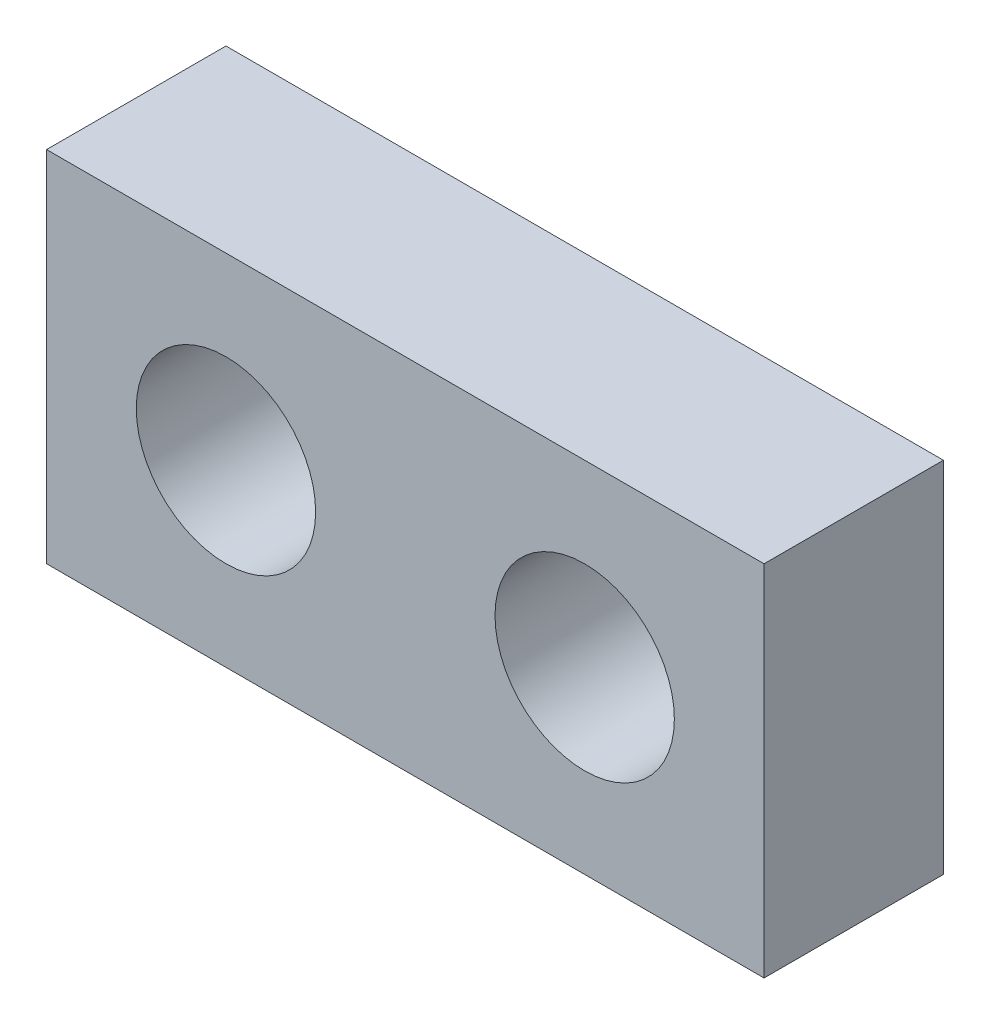
ISO-10303-21;
HEADER;
FILE_DESCRIPTION(('STEP AP214'),'2;1');
FILE_NAME('part.step','',(''),(''),'','','');
FILE_SCHEMA(('AUTOMOTIVE_DESIGN { 1 0 10303 214 1 1 1 1 }'));
ENDSEC;
DATA;
#1=APPLICATION_CONTEXT('core data for automotive mechanical design processes');
#2=APPLICATION_PROTOCOL_DEFINITION('international standard','automotive_design',2000,#1);
#3=PRODUCT_CONTEXT('',#1,'mechanical');
#4=PRODUCT('Part','Part','',(#3));
#5=PRODUCT_RELATED_PRODUCT_CATEGORY('part','',(#4));
#6=PRODUCT_DEFINITION_FORMATION('','',#4);
#7=PRODUCT_DEFINITION_CONTEXT('part definition',#1,'design');
#8=PRODUCT_DEFINITION('design','',#6,#7);
#9=PRODUCT_DEFINITION_SHAPE('','',#8);
#10=(LENGTH_UNIT() NAMED_UNIT(*) SI_UNIT(.MILLI.,.METRE.));
#11=(NAMED_UNIT(*) PLANE_ANGLE_UNIT() SI_UNIT($,.RADIAN.));
#12=(NAMED_UNIT(*) SI_UNIT($,.STERADIAN.) SOLID_ANGLE_UNIT());
#13=UNCERTAINTY_MEASURE_WITH_UNIT(LENGTH_MEASURE(1.E-05),#10,'distance_accuracy_value','');
#14=(GEOMETRIC_REPRESENTATION_CONTEXT(3) GLOBAL_UNCERTAINTY_ASSIGNED_CONTEXT((#13)) GLOBAL_UNIT_ASSIGNED_CONTEXT((#10,
#11,#12)) REPRESENTATION_CONTEXT('',''));
#15=CARTESIAN_POINT('',(0.,0.,0.));
#16=DIRECTION('',(0.,0.,1.));
#17=DIRECTION('',(1.,0.,0.));
#18=AXIS2_PLACEMENT_3D('',#15,#16,#17);
#19=CARTESIAN_POINT('',(0.,0.,5.));
#20=DIRECTION('',(0.,0.,1.));
#21=DIRECTION('',(1.,0.,0.));
#22=AXIS2_PLACEMENT_3D('',#19,#20,#21);
#23=PLANE('',#22);
#24=CARTESIAN_POINT('',(-5.,0.,5.));
#25=DIRECTION('',(0.,0.,1.));
#26=DIRECTION('',(1.,0.,0.));
#27=AXIS2_PLACEMENT_3D('',#24,#25,#26);
#28=CIRCLE('',#27,2.5);
#29=CARTESIAN_POINT('',(-2.5,0.,5.));
#30=VERTEX_POINT('',#29);
#31=EDGE_CURVE('E104',#30,#30,#28,.T.);
#32=ORIENTED_EDGE('',*,*,#31,.F.);
#33=EDGE_LOOP('',(#32));
#34=FACE_BOUND('',#33,.T.);
#35=DIRECTION('',(0.,-1.,0.));
#36=VECTOR('',#35,1.);
#37=CARTESIAN_POINT('',(-10.,-5.,5.));
#38=LINE('',#37,#36);
#39=CARTESIAN_POINT('',(-10.,5.,5.));
#40=VERTEX_POINT('',#39);
#41=CARTESIAN_POINT('',(-10.,-5.,5.));
#42=VERTEX_POINT('',#41);
#43=EDGE_CURVE('E89',#40,#42,#38,.T.);
#44=ORIENTED_EDGE('',*,*,#43,.T.);
#45=DIRECTION('',(1.,0.,0.));
#46=VECTOR('',#45,1.);
#47=CARTESIAN_POINT('',(10.,-5.,5.));
#48=LINE('',#47,#46);
#49=CARTESIAN_POINT('',(10.,-5.,5.));
#50=VERTEX_POINT('',#49);
#51=EDGE_CURVE('E84',#42,#50,#48,.T.);
#52=ORIENTED_EDGE('',*,*,#51,.T.);
#53=DIRECTION('',(0.,1.,0.));
#54=VECTOR('',#53,1.);
#55=CARTESIAN_POINT('',(10.,-5.,5.));
#56=LINE('',#55,#54);
#57=CARTESIAN_POINT('',(10.,5.,5.));
#58=VERTEX_POINT('',#57);
#59=EDGE_CURVE('E87',#50,#58,#56,.T.);
#60=ORIENTED_EDGE('',*,*,#59,.T.);
#61=DIRECTION('',(-1.,0.,0.));
#62=VECTOR('',#61,1.);
#63=CARTESIAN_POINT('',(10.,5.,5.));
#64=LINE('',#63,#62);
#65=EDGE_CURVE('E54',#58,#40,#64,.T.);
#66=ORIENTED_EDGE('',*,*,#65,.T.);
#67=EDGE_LOOP('',(#44,#52,#60,#66));
#68=FACE_BOUND('',#67,.T.);
#69=CARTESIAN_POINT('',(5.,0.,5.));
#70=DIRECTION('',(0.,0.,1.));
#71=DIRECTION('',(1.,0.,0.));
#72=AXIS2_PLACEMENT_3D('',#69,#70,#71);
#73=CIRCLE('',#72,2.5);
#74=CARTESIAN_POINT('',(7.5,0.,5.));
#75=VERTEX_POINT('',#74);
#76=EDGE_CURVE('E119',#75,#75,#73,.T.);
#77=ORIENTED_EDGE('',*,*,#76,.F.);
#78=EDGE_LOOP('',(#77));
#79=FACE_BOUND('',#78,.T.);
#80=ADVANCED_FACE('F37',(#34,#68,#79),#23,.T.);
#81=CARTESIAN_POINT('',(0.,0.,0.));
#82=DIRECTION('',(0.,0.,1.));
#83=DIRECTION('',(1.,0.,0.));
#84=AXIS2_PLACEMENT_3D('',#81,#82,#83);
#85=PLANE('',#84);
#86=DIRECTION('',(0.,-1.,0.));
#87=VECTOR('',#86,1.);
#88=CARTESIAN_POINT('',(-10.,-5.,0.));
#89=LINE('',#88,#87);
#90=CARTESIAN_POINT('',(-10.,5.,0.));
#91=VERTEX_POINT('',#90);
#92=CARTESIAN_POINT('',(-10.,-5.,0.));
#93=VERTEX_POINT('',#92);
#94=EDGE_CURVE('E101',#91,#93,#89,.T.);
#95=ORIENTED_EDGE('',*,*,#94,.F.);
#96=DIRECTION('',(-1.,0.,0.));
#97=VECTOR('',#96,1.);
#98=CARTESIAN_POINT('',(10.,5.,0.));
#99=LINE('',#98,#97);
#100=CARTESIAN_POINT('',(10.,5.,0.));
#101=VERTEX_POINT('',#100);
#102=EDGE_CURVE('E77',#101,#91,#99,.T.);
#103=ORIENTED_EDGE('',*,*,#102,.F.);
#104=DIRECTION('',(0.,1.,0.));
#105=VECTOR('',#104,1.);
#106=CARTESIAN_POINT('',(10.,-5.,0.));
#107=LINE('',#106,#105);
#108=CARTESIAN_POINT('',(10.,-5.,0.));
#109=VERTEX_POINT('',#108);
#110=EDGE_CURVE('E71',#109,#101,#107,.T.);
#111=ORIENTED_EDGE('',*,*,#110,.F.);
#112=DIRECTION('',(1.,0.,0.));
#113=VECTOR('',#112,1.);
#114=CARTESIAN_POINT('',(10.,-5.,0.));
#115=LINE('',#114,#113);
#116=EDGE_CURVE('E93',#93,#109,#115,.T.);
#117=ORIENTED_EDGE('',*,*,#116,.F.);
#118=EDGE_LOOP('',(#95,#103,#111,#117));
#119=FACE_BOUND('',#118,.T.);
#120=CARTESIAN_POINT('',(-5.,0.,0.));
#121=DIRECTION('',(0.,0.,1.));
#122=DIRECTION('',(1.,0.,0.));
#123=AXIS2_PLACEMENT_3D('',#120,#121,#122);
#124=CIRCLE('',#123,2.5);
#125=CARTESIAN_POINT('',(-2.5,0.,0.));
#126=VERTEX_POINT('',#125);
#127=EDGE_CURVE('E116',#126,#126,#124,.T.);
#128=ORIENTED_EDGE('',*,*,#127,.T.);
#129=EDGE_LOOP('',(#128));
#130=FACE_BOUND('',#129,.T.);
#131=CARTESIAN_POINT('',(5.,0.,0.));
#132=DIRECTION('',(0.,0.,1.));
#133=DIRECTION('',(1.,0.,0.));
#134=AXIS2_PLACEMENT_3D('',#131,#132,#133);
#135=CIRCLE('',#134,2.5);
#136=CARTESIAN_POINT('',(7.5,0.,0.));
#137=VERTEX_POINT('',#136);
#138=EDGE_CURVE('E122',#137,#137,#135,.T.);
#139=ORIENTED_EDGE('',*,*,#138,.T.);
#140=EDGE_LOOP('',(#139));
#141=FACE_BOUND('',#140,.T.);
#142=ADVANCED_FACE('F112',(#119,#130,#141),#85,.F.);
#143=CARTESIAN_POINT('',(-10.,-5.,5.));
#144=DIRECTION('',(1.,0.,0.));
#145=DIRECTION('',(0.,0.,-1.));
#146=AXIS2_PLACEMENT_3D('',#143,#144,#145);
#147=PLANE('',#146);
#148=ORIENTED_EDGE('',*,*,#94,.T.);
#149=DIRECTION('',(0.,0.,-1.));
#150=VECTOR('',#149,1.);
#151=CARTESIAN_POINT('',(-10.,-5.,5.));
#152=LINE('',#151,#150);
#153=EDGE_CURVE('E11',#42,#93,#152,.T.);
#154=ORIENTED_EDGE('',*,*,#153,.F.);
#155=ORIENTED_EDGE('',*,*,#43,.F.);
#156=DIRECTION('',(0.,0.,-1.));
#157=VECTOR('',#156,1.);
#158=CARTESIAN_POINT('',(-10.,5.,5.));
#159=LINE('',#158,#157);
#160=EDGE_CURVE('E97',#40,#91,#159,.T.);
#161=ORIENTED_EDGE('',*,*,#160,.T.);
#162=EDGE_LOOP('',(#148,#154,#155,#161));
#163=FACE_BOUND('',#162,.T.);
#164=ADVANCED_FACE('F39',(#163),#147,.F.);
#165=CARTESIAN_POINT('',(10.,-5.,5.));
#166=DIRECTION('',(0.,1.,0.));
#167=DIRECTION('',(-1.,0.,0.));
#168=AXIS2_PLACEMENT_3D('',#165,#166,#167);
#169=PLANE('',#168);
#170=ORIENTED_EDGE('',*,*,#116,.T.);
#171=DIRECTION('',(0.,0.,-1.));
#172=VECTOR('',#171,1.);
#173=CARTESIAN_POINT('',(10.,-5.,5.));
#174=LINE('',#173,#172);
#175=EDGE_CURVE('E46',#50,#109,#174,.T.);
#176=ORIENTED_EDGE('',*,*,#175,.F.);
#177=ORIENTED_EDGE('',*,*,#51,.F.);
#178=ORIENTED_EDGE('',*,*,#153,.T.);
#179=EDGE_LOOP('',(#170,#176,#177,#178));
#180=FACE_BOUND('',#179,.T.);
#181=ADVANCED_FACE('F92',(#180),#169,.F.);
#182=CARTESIAN_POINT('',(10.,-5.,5.));
#183=DIRECTION('',(-1.,0.,0.));
#184=DIRECTION('',(0.,0.,1.));
#185=AXIS2_PLACEMENT_3D('',#182,#183,#184);
#186=PLANE('',#185);
#187=ORIENTED_EDGE('',*,*,#110,.T.);
#188=DIRECTION('',(0.,0.,-1.));
#189=VECTOR('',#188,1.);
#190=CARTESIAN_POINT('',(10.,5.,5.));
#191=LINE('',#190,#189);
#192=EDGE_CURVE('E94',#58,#101,#191,.T.);
#193=ORIENTED_EDGE('',*,*,#192,.F.);
#194=ORIENTED_EDGE('',*,*,#59,.F.);
#195=ORIENTED_EDGE('',*,*,#175,.T.);
#196=EDGE_LOOP('',(#187,#193,#194,#195));
#197=FACE_BOUND('',#196,.T.);
#198=ADVANCED_FACE('F95',(#197),#186,.F.);
#199=CARTESIAN_POINT('',(10.,5.,5.));
#200=DIRECTION('',(0.,-1.,0.));
#201=DIRECTION('',(1.,0.,0.));
#202=AXIS2_PLACEMENT_3D('',#199,#200,#201);
#203=PLANE('',#202);
#204=ORIENTED_EDGE('',*,*,#102,.T.);
#205=ORIENTED_EDGE('',*,*,#160,.F.);
#206=ORIENTED_EDGE('',*,*,#65,.F.);
#207=ORIENTED_EDGE('',*,*,#192,.T.);
#208=EDGE_LOOP('',(#204,#205,#206,#207));
#209=FACE_BOUND('',#208,.T.);
#210=ADVANCED_FACE('F109',(#209),#203,.F.);
#211=CARTESIAN_POINT('',(-5.,0.,5.));
#212=DIRECTION('',(0.,0.,-1.));
#213=DIRECTION('',(-1.,0.,0.));
#214=AXIS2_PLACEMENT_3D('',#211,#212,#213);
#215=CYLINDRICAL_SURFACE('',#214,2.5);
#216=ORIENTED_EDGE('',*,*,#31,.T.);
#217=EDGE_LOOP('',(#216));
#218=FACE_BOUND('',#217,.T.);
#219=ORIENTED_EDGE('',*,*,#127,.F.);
#220=EDGE_LOOP('',(#219));
#221=FACE_BOUND('',#220,.T.);
#222=ADVANCED_FACE('F139',(#218,#221),#215,.F.);
#223=CARTESIAN_POINT('',(5.,0.,5.));
#224=DIRECTION('',(0.,0.,-1.));
#225=DIRECTION('',(-1.,0.,0.));
#226=AXIS2_PLACEMENT_3D('',#223,#224,#225);
#227=CYLINDRICAL_SURFACE('',#226,2.5);
#228=ORIENTED_EDGE('',*,*,#76,.T.);
#229=EDGE_LOOP('',(#228));
#230=FACE_BOUND('',#229,.T.);
#231=ORIENTED_EDGE('',*,*,#138,.F.);
#232=EDGE_LOOP('',(#231));
#233=FACE_BOUND('',#232,.T.);
#234=ADVANCED_FACE('F128',(#230,#233),#227,.F.);
#235=CLOSED_SHELL('',(#80,#142,#164,#181,#198,#210,#222,#234));
#236=MANIFOLD_SOLID_BREP('B2',#235);
#237=ADVANCED_BREP_SHAPE_REPRESENTATION('',(#18,#236),#14);
#238=SHAPE_DEFINITION_REPRESENTATION(#9,#237);
ENDSEC;
END-ISO-10303-21;
